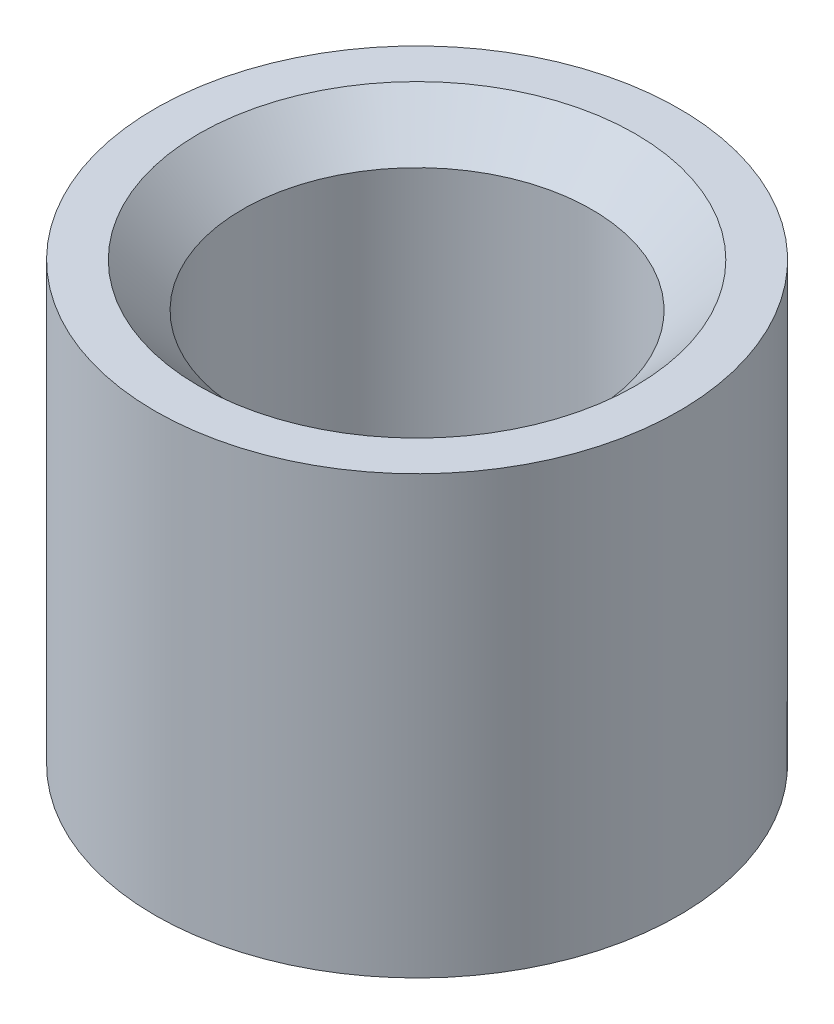
ISO-10303-21;
HEADER;
FILE_DESCRIPTION(('STEP AP214'),'2;1');
FILE_NAME('part.step','',(''),(''),'','','');
FILE_SCHEMA(('AUTOMOTIVE_DESIGN { 1 0 10303 214 1 1 1 1 }'));
ENDSEC;
DATA;
#1=APPLICATION_CONTEXT('core data for automotive mechanical design processes');
#2=APPLICATION_PROTOCOL_DEFINITION('international standard','automotive_design',2000,#1);
#3=PRODUCT_CONTEXT('',#1,'mechanical');
#4=PRODUCT('Part','Part','',(#3));
#5=PRODUCT_RELATED_PRODUCT_CATEGORY('part','',(#4));
#6=PRODUCT_DEFINITION_FORMATION('','',#4);
#7=PRODUCT_DEFINITION_CONTEXT('part definition',#1,'design');
#8=PRODUCT_DEFINITION('design','',#6,#7);
#9=PRODUCT_DEFINITION_SHAPE('','',#8);
#10=(LENGTH_UNIT() NAMED_UNIT(*) SI_UNIT(.MILLI.,.METRE.));
#11=(NAMED_UNIT(*) PLANE_ANGLE_UNIT() SI_UNIT($,.RADIAN.));
#12=(NAMED_UNIT(*) SI_UNIT($,.STERADIAN.) SOLID_ANGLE_UNIT());
#13=UNCERTAINTY_MEASURE_WITH_UNIT(LENGTH_MEASURE(1.E-05),#10,'distance_accuracy_value','');
#14=(GEOMETRIC_REPRESENTATION_CONTEXT(3) GLOBAL_UNCERTAINTY_ASSIGNED_CONTEXT((#13)) GLOBAL_UNIT_ASSIGNED_CONTEXT((#10,
#11,#12)) REPRESENTATION_CONTEXT('',''));
#15=CARTESIAN_POINT('',(0.,0.,0.));
#16=DIRECTION('',(0.,0.,1.));
#17=DIRECTION('',(1.,0.,0.));
#18=AXIS2_PLACEMENT_3D('',#15,#16,#17);
#19=CARTESIAN_POINT('',(0.,10.,0.));
#20=DIRECTION('',(0.,1.,0.));
#21=DIRECTION('',(0.,0.,1.));
#22=AXIS2_PLACEMENT_3D('',#19,#20,#21);
#23=PLANE('',#22);
#24=CARTESIAN_POINT('',(0.,10.,0.));
#25=DIRECTION('',(0.,1.,0.));
#26=DIRECTION('',(0.,0.,1.));
#27=AXIS2_PLACEMENT_3D('',#24,#25,#26);
#28=CIRCLE('',#27,5.);
#29=CARTESIAN_POINT('',(0.,10.,5.));
#30=VERTEX_POINT('',#29);
#31=EDGE_CURVE('E10',#30,#30,#28,.F.);
#32=ORIENTED_EDGE('',*,*,#31,.T.);
#33=EDGE_LOOP('',(#32));
#34=FACE_BOUND('',#33,.T.);
#35=CARTESIAN_POINT('',(0.,10.,0.));
#36=DIRECTION('',(0.,1.,0.));
#37=DIRECTION('',(0.,0.,1.));
#38=AXIS2_PLACEMENT_3D('',#35,#36,#37);
#39=CIRCLE('',#38,6.);
#40=CARTESIAN_POINT('',(0.,10.,6.));
#41=VERTEX_POINT('',#40);
#42=EDGE_CURVE('E54',#41,#41,#39,.T.);
#43=ORIENTED_EDGE('',*,*,#42,.T.);
#44=EDGE_LOOP('',(#43));
#45=FACE_BOUND('',#44,.T.);
#46=ADVANCED_FACE('F42',(#34,#45),#23,.T.);
#47=CARTESIAN_POINT('',(0.,0.,0.));
#48=DIRECTION('',(0.,1.,0.));
#49=DIRECTION('',(0.,0.,1.));
#50=AXIS2_PLACEMENT_3D('',#47,#48,#49);
#51=PLANE('',#50);
#52=CARTESIAN_POINT('',(0.,0.,0.));
#53=DIRECTION('',(0.,1.,0.));
#54=DIRECTION('',(0.,0.,1.));
#55=AXIS2_PLACEMENT_3D('',#52,#53,#54);
#56=CIRCLE('',#55,6.);
#57=CARTESIAN_POINT('',(0.,0.,6.));
#58=VERTEX_POINT('',#57);
#59=EDGE_CURVE('E59',#58,#58,#56,.T.);
#60=ORIENTED_EDGE('',*,*,#59,.F.);
#61=EDGE_LOOP('',(#60));
#62=FACE_BOUND('',#61,.T.);
#63=CARTESIAN_POINT('',(0.,0.,0.));
#64=DIRECTION('',(0.,1.,0.));
#65=DIRECTION('',(0.,0.,1.));
#66=AXIS2_PLACEMENT_3D('',#63,#64,#65);
#67=CIRCLE('',#66,4.);
#68=CARTESIAN_POINT('',(0.,0.,4.));
#69=VERTEX_POINT('',#68);
#70=EDGE_CURVE('E63',#69,#69,#67,.T.);
#71=ORIENTED_EDGE('',*,*,#70,.T.);
#72=EDGE_LOOP('',(#71));
#73=FACE_BOUND('',#72,.T.);
#74=ADVANCED_FACE('F68',(#62,#73),#51,.F.);
#75=CARTESIAN_POINT('',(0.,10.,0.));
#76=DIRECTION('',(0.,-1.,0.));
#77=DIRECTION('',(0.,0.,-1.));
#78=AXIS2_PLACEMENT_3D('',#75,#76,#77);
#79=CYLINDRICAL_SURFACE('',#78,6.);
#80=ORIENTED_EDGE('',*,*,#42,.F.);
#81=EDGE_LOOP('',(#80));
#82=FACE_BOUND('',#81,.T.);
#83=ORIENTED_EDGE('',*,*,#59,.T.);
#84=EDGE_LOOP('',(#83));
#85=FACE_BOUND('',#84,.T.);
#86=ADVANCED_FACE('F72',(#82,#85),#79,.T.);
#87=CARTESIAN_POINT('',(0.,10.,0.));
#88=DIRECTION('',(0.,-1.,0.));
#89=DIRECTION('',(0.,0.,-1.));
#90=AXIS2_PLACEMENT_3D('',#87,#88,#89);
#91=CYLINDRICAL_SURFACE('',#90,4.);
#92=CARTESIAN_POINT('',(0.,9.,0.));
#93=DIRECTION('',(0.,1.,0.));
#94=DIRECTION('',(0.,0.,1.));
#95=AXIS2_PLACEMENT_3D('',#92,#93,#94);
#96=CIRCLE('',#95,4.);
#97=CARTESIAN_POINT('',(0.,9.,4.));
#98=VERTEX_POINT('',#97);
#99=EDGE_CURVE('E49',#98,#98,#96,.T.);
#100=ORIENTED_EDGE('',*,*,#99,.T.);
#101=EDGE_LOOP('',(#100));
#102=FACE_BOUND('',#101,.T.);
#103=ORIENTED_EDGE('',*,*,#70,.F.);
#104=EDGE_LOOP('',(#103));
#105=FACE_BOUND('',#104,.T.);
#106=ADVANCED_FACE('F70',(#102,#105),#91,.F.);
#107=CARTESIAN_POINT('',(0.,9.,0.));
#108=DIRECTION('',(0.,1.,0.));
#109=DIRECTION('',(0.,0.,1.));
#110=AXIS2_PLACEMENT_3D('',#107,#108,#109);
#111=CONICAL_SURFACE('',#110,4.,0.78539816339745);
#112=ORIENTED_EDGE('',*,*,#31,.F.);
#113=EDGE_LOOP('',(#112));
#114=FACE_BOUND('',#113,.T.);
#115=ORIENTED_EDGE('',*,*,#99,.F.);
#116=EDGE_LOOP('',(#115));
#117=FACE_BOUND('',#116,.T.);
#118=ADVANCED_FACE('F44',(#114,#117),#111,.F.);
#119=CLOSED_SHELL('',(#46,#74,#86,#106,#118));
#120=MANIFOLD_SOLID_BREP('B2',#119);
#121=ADVANCED_BREP_SHAPE_REPRESENTATION('',(#18,#120),#14);
#122=SHAPE_DEFINITION_REPRESENTATION(#9,#121);
ENDSEC;
END-ISO-10303-21;
